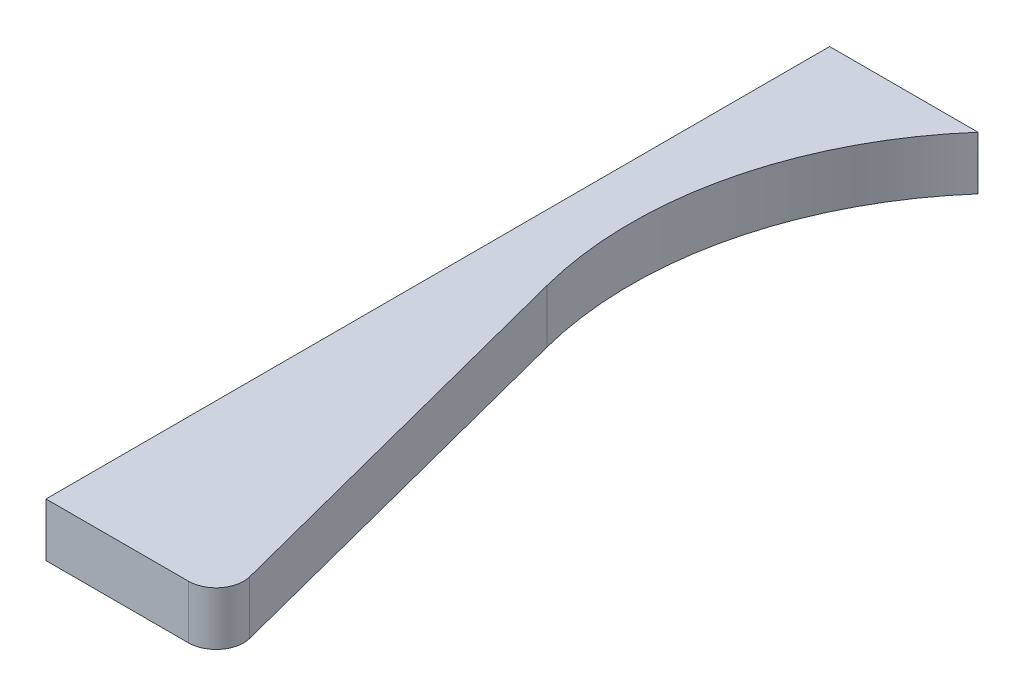
ISO-10303-21;
HEADER;
FILE_DESCRIPTION(('STEP AP214'),'2;1');
FILE_NAME('part.step','',(''),(''),'','','');
FILE_SCHEMA(('AUTOMOTIVE_DESIGN { 1 0 10303 214 1 1 1 1 }'));
ENDSEC;
DATA;
#1=APPLICATION_CONTEXT('core data for automotive mechanical design processes');
#2=APPLICATION_PROTOCOL_DEFINITION('international standard','automotive_design',2000,#1);
#3=PRODUCT_CONTEXT('',#1,'mechanical');
#4=PRODUCT('Part','Part','',(#3));
#5=PRODUCT_RELATED_PRODUCT_CATEGORY('part','',(#4));
#6=PRODUCT_DEFINITION_FORMATION('','',#4);
#7=PRODUCT_DEFINITION_CONTEXT('part definition',#1,'design');
#8=PRODUCT_DEFINITION('design','',#6,#7);
#9=PRODUCT_DEFINITION_SHAPE('','',#8);
#10=(LENGTH_UNIT() NAMED_UNIT(*) SI_UNIT(.MILLI.,.METRE.));
#11=(NAMED_UNIT(*) PLANE_ANGLE_UNIT() SI_UNIT($,.RADIAN.));
#12=(NAMED_UNIT(*) SI_UNIT($,.STERADIAN.) SOLID_ANGLE_UNIT());
#13=UNCERTAINTY_MEASURE_WITH_UNIT(LENGTH_MEASURE(1.E-05),#10,'distance_accuracy_value','');
#14=(GEOMETRIC_REPRESENTATION_CONTEXT(3) GLOBAL_UNCERTAINTY_ASSIGNED_CONTEXT((#13)) GLOBAL_UNIT_ASSIGNED_CONTEXT((#10,
#11,#12)) REPRESENTATION_CONTEXT('',''));
#15=CARTESIAN_POINT('',(0.,0.,0.));
#16=DIRECTION('',(0.,0.,1.));
#17=DIRECTION('',(1.,0.,0.));
#18=AXIS2_PLACEMENT_3D('',#15,#16,#17);
#19=CARTESIAN_POINT('',(50.8,19.05,269.5575));
#20=DIRECTION('',(0.,-1.,0.));
#21=DIRECTION('',(0.,0.,-1.));
#22=AXIS2_PLACEMENT_3D('',#19,#20,#21);
#23=CYLINDRICAL_SURFACE('',#22,9.8425);
#24=CARTESIAN_POINT('',(50.8,0.,269.5575));
#25=DIRECTION('',(0.,1.,0.));
#26=DIRECTION('',(0.,0.,1.));
#27=AXIS2_PLACEMENT_3D('',#24,#25,#26);
#28=CIRCLE('',#27,9.8425);
#29=CARTESIAN_POINT('',(50.8,0.,279.4));
#30=VERTEX_POINT('',#29);
#31=CARTESIAN_POINT('',(60.3295715151919,0.,267.095372264312));
#32=VERTEX_POINT('',#31);
#33=EDGE_CURVE('E117',#30,#32,#28,.T.);
#34=ORIENTED_EDGE('',*,*,#33,.T.);
#35=DIRECTION('',(0.,-1.,0.));
#36=VECTOR('',#35,1.);
#37=CARTESIAN_POINT('',(60.3295715151919,19.05,267.095372264312));
#38=LINE('',#37,#36);
#39=CARTESIAN_POINT('',(60.3295715151919,19.05,267.095372264312));
#40=VERTEX_POINT('',#39);
#41=EDGE_CURVE('E11',#40,#32,#38,.T.);
#42=ORIENTED_EDGE('',*,*,#41,.F.);
#43=CARTESIAN_POINT('',(50.8,19.05,269.5575));
#44=DIRECTION('',(0.,1.,0.));
#45=DIRECTION('',(0.,0.,1.));
#46=AXIS2_PLACEMENT_3D('',#43,#44,#45);
#47=CIRCLE('',#46,9.8425);
#48=CARTESIAN_POINT('',(50.8,19.05,279.4));
#49=VERTEX_POINT('',#48);
#50=EDGE_CURVE('E127',#49,#40,#47,.T.);
#51=ORIENTED_EDGE('',*,*,#50,.F.);
#52=DIRECTION('',(0.,-1.,0.));
#53=VECTOR('',#52,1.);
#54=CARTESIAN_POINT('',(50.8,19.05,279.4));
#55=LINE('',#54,#53);
#56=EDGE_CURVE('E113',#49,#30,#55,.T.);
#57=ORIENTED_EDGE('',*,*,#56,.T.);
#58=EDGE_LOOP('',(#34,#42,#51,#57));
#59=FACE_BOUND('',#58,.T.);
#60=ADVANCED_FACE('F33',(#59),#23,.T.);
#61=CARTESIAN_POINT('',(60.3295715151919,19.05,267.095372264312));
#62=DIRECTION('',(-0.968206402356298,0.,0.250152678251251));
#63=DIRECTION('',(0.250152678251251,0.,0.968206402356298));
#64=AXIS2_PLACEMENT_3D('',#61,#62,#63);
#65=PLANE('',#64);
#66=DIRECTION('',(-0.250152678251251,0.,-0.968206402356298));
#67=VECTOR('',#66,1.);
#68=CARTESIAN_POINT('',(60.3295715151919,0.,267.095372264312));
#69=LINE('',#68,#67);
#70=CARTESIAN_POINT('',(23.3894511674077,0.,124.120045057885));
#71=VERTEX_POINT('',#70);
#72=EDGE_CURVE('E120',#32,#71,#69,.T.);
#73=ORIENTED_EDGE('',*,*,#72,.T.);
#74=DIRECTION('',(0.,-1.,0.));
#75=VECTOR('',#74,1.);
#76=CARTESIAN_POINT('',(23.3894511674077,19.05,124.120045057885));
#77=LINE('',#76,#75);
#78=CARTESIAN_POINT('',(23.3894511674077,19.05,124.120045057885));
#79=VERTEX_POINT('',#78);
#80=EDGE_CURVE('E41',#79,#71,#77,.T.);
#81=ORIENTED_EDGE('',*,*,#80,.F.);
#82=DIRECTION('',(-0.250152678251251,0.,-0.968206402356298));
#83=VECTOR('',#82,1.);
#84=CARTESIAN_POINT('',(60.3295715151919,19.05,267.095372264312));
#85=LINE('',#84,#83);
#86=EDGE_CURVE('E86',#40,#79,#85,.T.);
#87=ORIENTED_EDGE('',*,*,#86,.F.);
#88=ORIENTED_EDGE('',*,*,#41,.T.);
#89=EDGE_LOOP('',(#73,#81,#87,#88));
#90=FACE_BOUND('',#89,.T.);
#91=ADVANCED_FACE('F151',(#90),#65,.F.);
#92=CARTESIAN_POINT('',(155.538207973132,19.05,89.9771542836918));
#93=DIRECTION('',(0.,-1.,0.));
#94=DIRECTION('',(0.,0.,-1.));
#95=AXIS2_PLACEMENT_3D('',#92,#93,#94);
#96=CYLINDRICAL_SURFACE('',#95,136.488207973132);
#97=CARTESIAN_POINT('',(155.538207973132,0.,89.9771542836918));
#98=DIRECTION('',(0.,-1.,0.));
#99=DIRECTION('',(0.,0.,-1.));
#100=AXIS2_PLACEMENT_3D('',#97,#98,#99);
#101=CIRCLE('',#100,136.488207973132);
#102=CARTESIAN_POINT('',(52.907108287288,0.,0.));
#103=VERTEX_POINT('',#102);
#104=EDGE_CURVE('E122',#71,#103,#101,.T.);
#105=ORIENTED_EDGE('',*,*,#104,.T.);
#106=DIRECTION('',(0.,-1.,0.));
#107=VECTOR('',#106,1.);
#108=CARTESIAN_POINT('',(52.907108287288,19.05,0.));
#109=LINE('',#108,#107);
#110=CARTESIAN_POINT('',(52.907108287288,19.05,0.));
#111=VERTEX_POINT('',#110);
#112=EDGE_CURVE('E108',#111,#103,#109,.T.);
#113=ORIENTED_EDGE('',*,*,#112,.F.);
#114=CARTESIAN_POINT('',(155.538207973132,19.05,89.9771542836918));
#115=DIRECTION('',(0.,-1.,0.));
#116=DIRECTION('',(0.,0.,-1.));
#117=AXIS2_PLACEMENT_3D('',#114,#115,#116);
#118=CIRCLE('',#117,136.488207973132);
#119=EDGE_CURVE('E99',#79,#111,#118,.T.);
#120=ORIENTED_EDGE('',*,*,#119,.F.);
#121=ORIENTED_EDGE('',*,*,#80,.T.);
#122=EDGE_LOOP('',(#105,#113,#120,#121));
#123=FACE_BOUND('',#122,.T.);
#124=ADVANCED_FACE('F133',(#123),#96,.F.);
#125=CARTESIAN_POINT('',(52.907108287288,19.05,0.));
#126=DIRECTION('',(0.,0.,1.));
#127=DIRECTION('',(1.,0.,0.));
#128=AXIS2_PLACEMENT_3D('',#125,#126,#127);
#129=PLANE('',#128);
#130=DIRECTION('',(-1.,0.,0.));
#131=VECTOR('',#130,1.);
#132=CARTESIAN_POINT('',(52.907108287288,0.,0.));
#133=LINE('',#132,#131);
#134=CARTESIAN_POINT('',(0.,0.,0.));
#135=VERTEX_POINT('',#134);
#136=EDGE_CURVE('E107',#103,#135,#133,.T.);
#137=ORIENTED_EDGE('',*,*,#136,.T.);
#138=DIRECTION('',(0.,-1.,0.));
#139=VECTOR('',#138,1.);
#140=CARTESIAN_POINT('',(0.,19.05,0.));
#141=LINE('',#140,#139);
#142=CARTESIAN_POINT('',(0.,19.05,0.));
#143=VERTEX_POINT('',#142);
#144=EDGE_CURVE('E104',#143,#135,#141,.T.);
#145=ORIENTED_EDGE('',*,*,#144,.F.);
#146=DIRECTION('',(-1.,0.,0.));
#147=VECTOR('',#146,1.);
#148=CARTESIAN_POINT('',(52.907108287288,19.05,0.));
#149=LINE('',#148,#147);
#150=EDGE_CURVE('E93',#111,#143,#149,.T.);
#151=ORIENTED_EDGE('',*,*,#150,.F.);
#152=ORIENTED_EDGE('',*,*,#112,.T.);
#153=EDGE_LOOP('',(#137,#145,#151,#152));
#154=FACE_BOUND('',#153,.T.);
#155=ADVANCED_FACE('F105',(#154),#129,.F.);
#156=CARTESIAN_POINT('',(0.,19.05,279.4));
#157=DIRECTION('',(1.,0.,0.));
#158=DIRECTION('',(0.,0.,-1.));
#159=AXIS2_PLACEMENT_3D('',#156,#157,#158);
#160=PLANE('',#159);
#161=DIRECTION('',(0.,0.,1.));
#162=VECTOR('',#161,1.);
#163=CARTESIAN_POINT('',(0.,0.,279.4));
#164=LINE('',#163,#162);
#165=CARTESIAN_POINT('',(0.,0.,279.4));
#166=VERTEX_POINT('',#165);
#167=EDGE_CURVE('E72',#135,#166,#164,.T.);
#168=ORIENTED_EDGE('',*,*,#167,.T.);
#169=DIRECTION('',(0.,-1.,0.));
#170=VECTOR('',#169,1.);
#171=CARTESIAN_POINT('',(0.,19.05,279.4));
#172=LINE('',#171,#170);
#173=CARTESIAN_POINT('',(0.,19.05,279.4));
#174=VERTEX_POINT('',#173);
#175=EDGE_CURVE('E109',#174,#166,#172,.T.);
#176=ORIENTED_EDGE('',*,*,#175,.F.);
#177=DIRECTION('',(0.,0.,1.));
#178=VECTOR('',#177,1.);
#179=CARTESIAN_POINT('',(0.,19.05,279.4));
#180=LINE('',#179,#178);
#181=EDGE_CURVE('E97',#143,#174,#180,.T.);
#182=ORIENTED_EDGE('',*,*,#181,.F.);
#183=ORIENTED_EDGE('',*,*,#144,.T.);
#184=EDGE_LOOP('',(#168,#176,#182,#183));
#185=FACE_BOUND('',#184,.T.);
#186=ADVANCED_FACE('F111',(#185),#160,.F.);
#187=CARTESIAN_POINT('',(50.8,19.05,279.4));
#188=DIRECTION('',(0.,0.,-1.));
#189=DIRECTION('',(-1.,0.,0.));
#190=AXIS2_PLACEMENT_3D('',#187,#188,#189);
#191=PLANE('',#190);
#192=DIRECTION('',(1.,0.,0.));
#193=VECTOR('',#192,1.);
#194=CARTESIAN_POINT('',(50.8,0.,279.4));
#195=LINE('',#194,#193);
#196=EDGE_CURVE('E78',#166,#30,#195,.T.);
#197=ORIENTED_EDGE('',*,*,#196,.T.);
#198=ORIENTED_EDGE('',*,*,#56,.F.);
#199=DIRECTION('',(1.,0.,0.));
#200=VECTOR('',#199,1.);
#201=CARTESIAN_POINT('',(50.8,19.05,279.4));
#202=LINE('',#201,#200);
#203=EDGE_CURVE('E49',#174,#49,#202,.T.);
#204=ORIENTED_EDGE('',*,*,#203,.F.);
#205=ORIENTED_EDGE('',*,*,#175,.T.);
#206=EDGE_LOOP('',(#197,#198,#204,#205));
#207=FACE_BOUND('',#206,.T.);
#208=ADVANCED_FACE('F140',(#207),#191,.F.);
#209=CARTESIAN_POINT('',(50.8,19.05,269.5575));
#210=DIRECTION('',(0.,1.,0.));
#211=DIRECTION('',(0.,0.,1.));
#212=AXIS2_PLACEMENT_3D('',#209,#210,#211);
#213=PLANE('',#212);
#214=ORIENTED_EDGE('',*,*,#50,.T.);
#215=ORIENTED_EDGE('',*,*,#86,.T.);
#216=ORIENTED_EDGE('',*,*,#119,.T.);
#217=ORIENTED_EDGE('',*,*,#150,.T.);
#218=ORIENTED_EDGE('',*,*,#181,.T.);
#219=ORIENTED_EDGE('',*,*,#203,.T.);
#220=EDGE_LOOP('',(#214,#215,#216,#217,#218,#219));
#221=FACE_BOUND('',#220,.T.);
#222=ADVANCED_FACE('F95',(#221),#213,.T.);
#223=CARTESIAN_POINT('',(50.8,0.,269.5575));
#224=DIRECTION('',(0.,1.,0.));
#225=DIRECTION('',(0.,0.,1.));
#226=AXIS2_PLACEMENT_3D('',#223,#224,#225);
#227=PLANE('',#226);
#228=ORIENTED_EDGE('',*,*,#33,.F.);
#229=ORIENTED_EDGE('',*,*,#196,.F.);
#230=ORIENTED_EDGE('',*,*,#167,.F.);
#231=ORIENTED_EDGE('',*,*,#136,.F.);
#232=ORIENTED_EDGE('',*,*,#104,.F.);
#233=ORIENTED_EDGE('',*,*,#72,.F.);
#234=EDGE_LOOP('',(#228,#229,#230,#231,#232,#233));
#235=FACE_BOUND('',#234,.T.);
#236=ADVANCED_FACE('F136',(#235),#227,.F.);
#237=CLOSED_SHELL('',(#60,#91,#124,#155,#186,#208,#222,#236));
#238=MANIFOLD_SOLID_BREP('B2',#237);
#239=ADVANCED_BREP_SHAPE_REPRESENTATION('',(#18,#238),#14);
#240=SHAPE_DEFINITION_REPRESENTATION(#9,#239);
ENDSEC;
END-ISO-10303-21;
